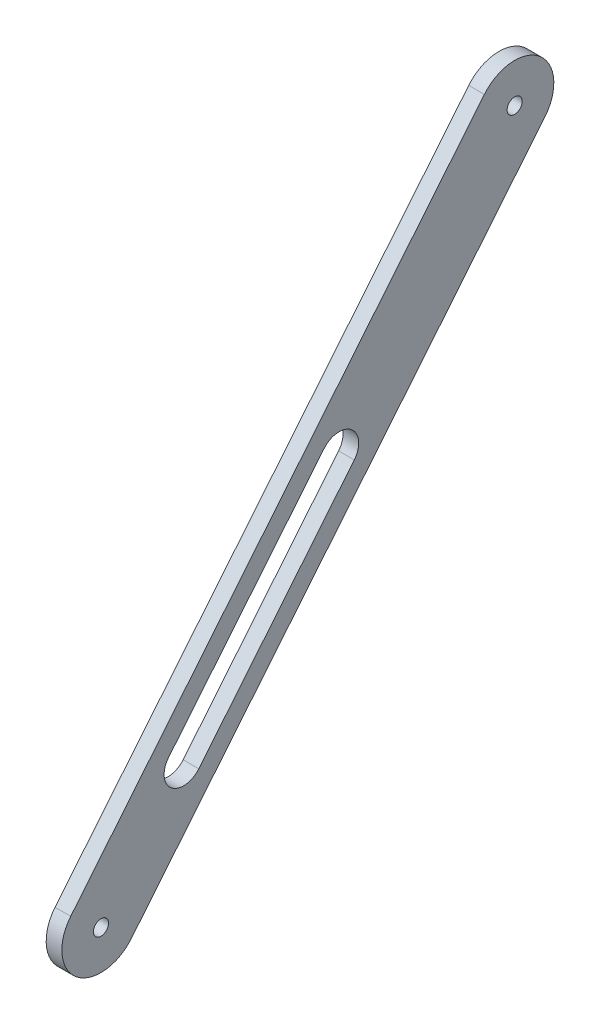
ISO-10303-21;
HEADER;
FILE_DESCRIPTION(('STEP AP214'),'2;1');
FILE_NAME('part.step','',(''),(''),'','','');
FILE_SCHEMA(('AUTOMOTIVE_DESIGN { 1 0 10303 214 1 1 1 1 }'));
ENDSEC;
DATA;
#1=APPLICATION_CONTEXT('core data for automotive mechanical design processes');
#2=APPLICATION_PROTOCOL_DEFINITION('international standard','automotive_design',2000,#1);
#3=PRODUCT_CONTEXT('',#1,'mechanical');
#4=PRODUCT('Part','Part','',(#3));
#5=PRODUCT_RELATED_PRODUCT_CATEGORY('part','',(#4));
#6=PRODUCT_DEFINITION_FORMATION('','',#4);
#7=PRODUCT_DEFINITION_CONTEXT('part definition',#1,'design');
#8=PRODUCT_DEFINITION('design','',#6,#7);
#9=PRODUCT_DEFINITION_SHAPE('','',#8);
#10=(LENGTH_UNIT() NAMED_UNIT(*) SI_UNIT(.MILLI.,.METRE.));
#11=(NAMED_UNIT(*) PLANE_ANGLE_UNIT() SI_UNIT($,.RADIAN.));
#12=(NAMED_UNIT(*) SI_UNIT($,.STERADIAN.) SOLID_ANGLE_UNIT());
#13=UNCERTAINTY_MEASURE_WITH_UNIT(LENGTH_MEASURE(1.E-05),#10,'distance_accuracy_value','');
#14=(GEOMETRIC_REPRESENTATION_CONTEXT(3) GLOBAL_UNCERTAINTY_ASSIGNED_CONTEXT((#13)) GLOBAL_UNIT_ASSIGNED_CONTEXT((#10,
#11,#12)) REPRESENTATION_CONTEXT('',''));
#15=CARTESIAN_POINT('',(0.,0.,0.));
#16=DIRECTION('',(0.,0.,1.));
#17=DIRECTION('',(1.,0.,0.));
#18=AXIS2_PLACEMENT_3D('',#15,#16,#17);
#19=CARTESIAN_POINT('',(-4.00000000017756,21949.5715431067,-17815.443941645));
#20=DIRECTION('',(0.,-0.633762743813113,-0.773527494375264));
#21=DIRECTION('',(0.,0.773527494375265,-0.633762743813113));
#22=AXIS2_PLACEMENT_3D('',#19,#20,#21);
#23=PLANE('',#22);
#24=DIRECTION('',(0.,-0.773527494375265,0.633762743813113));
#25=VECTOR('',#24,1.);
#26=CARTESIAN_POINT('',(-7.00000000017756,21949.5715431067,-17815.443941645));
#27=LINE('',#26,#25);
#28=CARTESIAN_POINT('',(-6.9999999999992,107.394735413521,80.1809781579693));
#29=VERTEX_POINT('',#28);
#30=CARTESIAN_POINT('',(-6.99999999999841,10.6467794213656,159.448037821336));
#31=VERTEX_POINT('',#30);
#32=EDGE_CURVE('E136',#29,#31,#27,.T.);
#33=ORIENTED_EDGE('',*,*,#32,.F.);
#34=DIRECTION('',(-1.,0.,0.));
#35=VECTOR('',#34,1.);
#36=CARTESIAN_POINT('',(-3.9999999999992,107.394735413521,80.1809781579693));
#37=LINE('',#36,#35);
#38=CARTESIAN_POINT('',(-3.9999999999992,107.394735413521,80.1809781579693));
#39=VERTEX_POINT('',#38);
#40=EDGE_CURVE('E11',#39,#29,#37,.T.);
#41=ORIENTED_EDGE('',*,*,#40,.F.);
#42=DIRECTION('',(0.,-0.773527494375265,0.633762743813113));
#43=VECTOR('',#42,1.);
#44=CARTESIAN_POINT('',(-4.00000000017756,21949.5715431067,-17815.443941645));
#45=LINE('',#44,#43);
#46=CARTESIAN_POINT('',(-3.99999999999841,10.6467794213656,159.448037821336));
#47=VERTEX_POINT('',#46);
#48=EDGE_CURVE('E140',#39,#47,#45,.T.);
#49=ORIENTED_EDGE('',*,*,#48,.T.);
#50=DIRECTION('',(-1.,0.,0.));
#51=VECTOR('',#50,1.);
#52=CARTESIAN_POINT('',(-3.99999999999841,10.6467794213656,159.448037821336));
#53=LINE('',#52,#51);
#54=EDGE_CURVE('E38',#47,#31,#53,.T.);
#55=ORIENTED_EDGE('',*,*,#54,.T.);
#56=EDGE_LOOP('',(#33,#41,#49,#55));
#57=FACE_BOUND('',#56,.T.);
#58=ADVANCED_FACE('F35',(#57),#23,.T.);
#59=CARTESIAN_POINT('',(-3.99999999999914,112.147955992155,85.9824343657549));
#60=DIRECTION('',(-1.,0.,0.));
#61=DIRECTION('',(0.,0.,1.));
#62=AXIS2_PLACEMENT_3D('',#59,#60,#61);
#63=CYLINDRICAL_SURFACE('',#62,7.49999999999999);
#64=CARTESIAN_POINT('',(-6.99999999999914,112.147955992155,85.9824343657549));
#65=DIRECTION('',(-1.,0.,0.));
#66=DIRECTION('',(0.,0.,1.));
#67=AXIS2_PLACEMENT_3D('',#64,#65,#66);
#68=CIRCLE('',#67,7.49999999999999);
#69=CARTESIAN_POINT('',(-6.99999999999909,116.901176570709,91.7838905736058));
#70=VERTEX_POINT('',#69);
#71=EDGE_CURVE('E144',#70,#29,#68,.T.);
#72=ORIENTED_EDGE('',*,*,#71,.F.);
#73=DIRECTION('',(-1.,0.,0.));
#74=VECTOR('',#73,1.);
#75=CARTESIAN_POINT('',(-3.99999999999909,116.901176570709,91.7838905736058));
#76=LINE('',#75,#74);
#77=CARTESIAN_POINT('',(-3.99999999999909,116.901176570709,91.7838905736058));
#78=VERTEX_POINT('',#77);
#79=EDGE_CURVE('E43',#78,#70,#76,.T.);
#80=ORIENTED_EDGE('',*,*,#79,.F.);
#81=CARTESIAN_POINT('',(-3.99999999999914,112.147955992155,85.9824343657549));
#82=DIRECTION('',(-1.,0.,0.));
#83=DIRECTION('',(0.,0.,1.));
#84=AXIS2_PLACEMENT_3D('',#81,#82,#83);
#85=CIRCLE('',#84,7.49999999999999);
#86=EDGE_CURVE('E150',#78,#39,#85,.T.);
#87=ORIENTED_EDGE('',*,*,#86,.T.);
#88=ORIENTED_EDGE('',*,*,#40,.T.);
#89=EDGE_LOOP('',(#72,#80,#87,#88));
#90=FACE_BOUND('',#89,.T.);
#91=ADVANCED_FACE('F176',(#90),#63,.T.);
#92=CARTESIAN_POINT('',(-4.00000000017745,21959.077984264,-17803.8410292294));
#93=DIRECTION('',(0.,0.633762743813113,0.773527494375264));
#94=DIRECTION('',(0.,-0.773527494375264,0.633762743813113));
#95=AXIS2_PLACEMENT_3D('',#92,#93,#94);
#96=PLANE('',#95);
#97=DIRECTION('',(0.,0.773527494375264,-0.633762743813113));
#98=VECTOR('',#97,1.);
#99=CARTESIAN_POINT('',(-7.00000000017745,21959.077984264,-17803.8410292294));
#100=LINE('',#99,#98);
#101=CARTESIAN_POINT('',(-6.99999999999829,20.1532205786314,171.050950236992));
#102=VERTEX_POINT('',#101);
#103=EDGE_CURVE('E158',#102,#70,#100,.T.);
#104=ORIENTED_EDGE('',*,*,#103,.F.);
#105=DIRECTION('',(-1.,0.,0.));
#106=VECTOR('',#105,1.);
#107=CARTESIAN_POINT('',(-3.99999999999829,20.1532205786314,171.050950236992));
#108=LINE('',#107,#106);
#109=CARTESIAN_POINT('',(-3.99999999999829,20.1532205786314,171.050950236992));
#110=VERTEX_POINT('',#109);
#111=EDGE_CURVE('E163',#110,#102,#108,.T.);
#112=ORIENTED_EDGE('',*,*,#111,.F.);
#113=DIRECTION('',(0.,0.773527494375264,-0.633762743813113));
#114=VECTOR('',#113,1.);
#115=CARTESIAN_POINT('',(-4.00000000017745,21959.077984264,-17803.8410292294));
#116=LINE('',#115,#114);
#117=EDGE_CURVE('E147',#110,#78,#116,.T.);
#118=ORIENTED_EDGE('',*,*,#117,.T.);
#119=ORIENTED_EDGE('',*,*,#79,.T.);
#120=EDGE_LOOP('',(#104,#112,#118,#119));
#121=FACE_BOUND('',#120,.T.);
#122=ADVANCED_FACE('F180',(#121),#96,.T.);
#123=CARTESIAN_POINT('',(-3.99999999999835,15.4,165.249494029121));
#124=DIRECTION('',(-1.,0.,0.));
#125=DIRECTION('',(0.,0.,1.));
#126=AXIS2_PLACEMENT_3D('',#123,#124,#125);
#127=CYLINDRICAL_SURFACE('',#126,7.50000000000002);
#128=CARTESIAN_POINT('',(-6.99999999999835,15.4,165.249494029121));
#129=DIRECTION('',(-1.,0.,0.));
#130=DIRECTION('',(0.,0.,1.));
#131=AXIS2_PLACEMENT_3D('',#128,#129,#130);
#132=CIRCLE('',#131,7.50000000000002);
#133=EDGE_CURVE('E155',#31,#102,#132,.T.);
#134=ORIENTED_EDGE('',*,*,#133,.F.);
#135=ORIENTED_EDGE('',*,*,#54,.F.);
#136=CARTESIAN_POINT('',(-3.99999999999835,15.4,165.249494029121));
#137=DIRECTION('',(-1.,0.,0.));
#138=DIRECTION('',(0.,0.,1.));
#139=AXIS2_PLACEMENT_3D('',#136,#137,#138);
#140=CIRCLE('',#139,7.50000000000002);
#141=EDGE_CURVE('E143',#47,#110,#140,.T.);
#142=ORIENTED_EDGE('',*,*,#141,.T.);
#143=ORIENTED_EDGE('',*,*,#111,.T.);
#144=EDGE_LOOP('',(#134,#135,#142,#143));
#145=FACE_BOUND('',#144,.T.);
#146=ADVANCED_FACE('F171',(#145),#127,.T.);
#147=CARTESIAN_POINT('',(-3.99999999999835,15.4,165.249494029121));
#148=DIRECTION('',(-1.,0.,0.));
#149=DIRECTION('',(0.,0.,1.));
#150=AXIS2_PLACEMENT_3D('',#147,#148,#149);
#151=PLANE('',#150);
#152=CARTESIAN_POINT('',(-3.99999999999914,112.147955992155,85.982434365755));
#153=DIRECTION('',(-1.,0.,0.));
#154=DIRECTION('',(0.,0.,1.));
#155=AXIS2_PLACEMENT_3D('',#152,#153,#154);
#156=CIRCLE('',#155,1.44999999999999);
#157=CARTESIAN_POINT('',(-3.99999999999913,112.147955992155,87.432434365755));
#158=VERTEX_POINT('',#157);
#159=EDGE_CURVE('E288',#158,#158,#156,.T.);
#160=ORIENTED_EDGE('',*,*,#159,.T.);
#161=EDGE_LOOP('',(#160));
#162=FACE_BOUND('',#161,.T.);
#163=CARTESIAN_POINT('',(-3.99999999999835,15.4,165.249494029121));
#164=DIRECTION('',(-1.,0.,0.));
#165=DIRECTION('',(0.,0.,1.));
#166=AXIS2_PLACEMENT_3D('',#163,#164,#165);
#167=CIRCLE('',#166,1.45);
#168=CARTESIAN_POINT('',(-3.99999999999834,15.4,166.699494029121));
#169=VERTEX_POINT('',#168);
#170=EDGE_CURVE('E124',#169,#169,#167,.T.);
#171=ORIENTED_EDGE('',*,*,#170,.T.);
#172=EDGE_LOOP('',(#171));
#173=FACE_BOUND('',#172,.T.);
#174=CARTESIAN_POINT('',(-3.99999999999881,71.093979595019,119.618576474577));
#175=DIRECTION('',(-1.,0.,0.));
#176=DIRECTION('',(0.,0.,1.));
#177=AXIS2_PLACEMENT_3D('',#174,#175,#176);
#178=CIRCLE('',#177,3.75000000000029);
#179=CARTESIAN_POINT('',(-3.99999999999878,73.4705898842804,122.519304578516));
#180=VERTEX_POINT('',#179);
#181=CARTESIAN_POINT('',(-3.99999999999884,68.7173693057074,116.71784837068));
#182=VERTEX_POINT('',#181);
#183=EDGE_CURVE('E108',#180,#182,#178,.T.);
#184=ORIENTED_EDGE('',*,*,#183,.T.);
#185=DIRECTION('',(0.,-0.773527494375264,0.633762743813113));
#186=VECTOR('',#185,1.);
#187=CARTESIAN_POINT('',(-4.00000000017753,21951.9481533962,-17812.5432135413));
#188=LINE('',#187,#186);
#189=CARTESIAN_POINT('',(-3.99999999999854,32.3615770700676,146.504697329898));
#190=VERTEX_POINT('',#189);
#191=EDGE_CURVE('E102',#182,#190,#188,.T.);
#192=ORIENTED_EDGE('',*,*,#191,.T.);
#193=CARTESIAN_POINT('',(-3.99999999999851,34.7381873593816,149.405425433794));
#194=DIRECTION('',(-1.,0.,0.));
#195=DIRECTION('',(0.,0.,1.));
#196=AXIS2_PLACEMENT_3D('',#193,#194,#195);
#197=CIRCLE('',#196,3.75000000000032);
#198=CARTESIAN_POINT('',(-3.99999999999848,37.1147976486775,152.306153537704));
#199=VERTEX_POINT('',#198);
#200=EDGE_CURVE('E111',#190,#199,#197,.T.);
#201=ORIENTED_EDGE('',*,*,#200,.T.);
#202=DIRECTION('',(0.,0.773527494375264,-0.633762743813114));
#203=VECTOR('',#202,1.);
#204=CARTESIAN_POINT('',(-4.00000000017748,21956.7013739752,-17806.7417573338));
#205=LINE('',#204,#203);
#206=EDGE_CURVE('E51',#199,#180,#205,.T.);
#207=ORIENTED_EDGE('',*,*,#206,.T.);
#208=EDGE_LOOP('',(#184,#192,#201,#207));
#209=FACE_BOUND('',#208,.T.);
#210=ORIENTED_EDGE('',*,*,#48,.F.);
#211=ORIENTED_EDGE('',*,*,#86,.F.);
#212=ORIENTED_EDGE('',*,*,#117,.F.);
#213=ORIENTED_EDGE('',*,*,#141,.F.);
#214=EDGE_LOOP('',(#210,#211,#212,#213));
#215=FACE_BOUND('',#214,.T.);
#216=ADVANCED_FACE('F115',(#162,#173,#209,#215),#151,.F.);
#217=CARTESIAN_POINT('',(-6.99999999999835,15.4,165.249494029121));
#218=DIRECTION('',(-1.,0.,0.));
#219=DIRECTION('',(0.,0.,1.));
#220=AXIS2_PLACEMENT_3D('',#217,#218,#219);
#221=PLANE('',#220);
#222=CARTESIAN_POINT('',(-7.00000000000007,112.147955992155,85.982434365755));
#223=DIRECTION('',(1.,0.,0.));
#224=DIRECTION('',(0.,0.,-1.));
#225=AXIS2_PLACEMENT_3D('',#222,#223,#224);
#226=CIRCLE('',#225,1.44999999999999);
#227=CARTESIAN_POINT('',(-7.00000000000008,112.147955992155,84.532434365755));
#228=VERTEX_POINT('',#227);
#229=EDGE_CURVE('E285',#228,#228,#226,.T.);
#230=ORIENTED_EDGE('',*,*,#229,.T.);
#231=EDGE_LOOP('',(#230));
#232=FACE_BOUND('',#231,.T.);
#233=CARTESIAN_POINT('',(-6.99999999999928,15.4,165.249494029122));
#234=DIRECTION('',(1.,0.,0.));
#235=DIRECTION('',(0.,0.,-1.));
#236=AXIS2_PLACEMENT_3D('',#233,#234,#235);
#237=CIRCLE('',#236,1.45);
#238=CARTESIAN_POINT('',(-6.99999999999929,15.4,163.799494029122));
#239=VERTEX_POINT('',#238);
#240=EDGE_CURVE('E289',#239,#239,#237,.T.);
#241=ORIENTED_EDGE('',*,*,#240,.T.);
#242=EDGE_LOOP('',(#241));
#243=FACE_BOUND('',#242,.T.);
#244=DIRECTION('',(0.,-0.773527494375264,0.633762743813113));
#245=VECTOR('',#244,1.);
#246=CARTESIAN_POINT('',(-7.00000000017753,21951.9481533962,-17812.5432135413));
#247=LINE('',#246,#245);
#248=CARTESIAN_POINT('',(-6.99999999999884,68.7173693057074,116.71784837068));
#249=VERTEX_POINT('',#248);
#250=CARTESIAN_POINT('',(-6.99999999999854,32.3615770700676,146.504697329898));
#251=VERTEX_POINT('',#250);
#252=EDGE_CURVE('E59',#249,#251,#247,.T.);
#253=ORIENTED_EDGE('',*,*,#252,.F.);
#254=CARTESIAN_POINT('',(-6.99999999999881,71.093979595019,119.618576474577));
#255=DIRECTION('',(-1.,0.,0.));
#256=DIRECTION('',(0.,0.,1.));
#257=AXIS2_PLACEMENT_3D('',#254,#255,#256);
#258=CIRCLE('',#257,3.75000000000029);
#259=CARTESIAN_POINT('',(-6.99999999999878,73.4705898842804,122.519304578516));
#260=VERTEX_POINT('',#259);
#261=EDGE_CURVE('E118',#260,#249,#258,.T.);
#262=ORIENTED_EDGE('',*,*,#261,.F.);
#263=DIRECTION('',(0.,0.773527494375264,-0.633762743813114));
#264=VECTOR('',#263,1.);
#265=CARTESIAN_POINT('',(-7.00000000017748,21956.7013739752,-17806.7417573338));
#266=LINE('',#265,#264);
#267=CARTESIAN_POINT('',(-6.99999999999848,37.1147976487158,152.306153537751));
#268=VERTEX_POINT('',#267);
#269=EDGE_CURVE('E121',#268,#260,#266,.T.);
#270=ORIENTED_EDGE('',*,*,#269,.F.);
#271=CARTESIAN_POINT('',(-6.99999999999851,34.7381873593816,149.405425433794));
#272=DIRECTION('',(-1.,0.,0.));
#273=DIRECTION('',(0.,0.,1.));
#274=AXIS2_PLACEMENT_3D('',#271,#272,#273);
#275=CIRCLE('',#274,3.75000000000032);
#276=EDGE_CURVE('E130',#251,#268,#275,.T.);
#277=ORIENTED_EDGE('',*,*,#276,.F.);
#278=EDGE_LOOP('',(#253,#262,#270,#277));
#279=FACE_BOUND('',#278,.T.);
#280=ORIENTED_EDGE('',*,*,#32,.T.);
#281=ORIENTED_EDGE('',*,*,#133,.T.);
#282=ORIENTED_EDGE('',*,*,#103,.T.);
#283=ORIENTED_EDGE('',*,*,#71,.T.);
#284=EDGE_LOOP('',(#280,#281,#282,#283));
#285=FACE_BOUND('',#284,.T.);
#286=ADVANCED_FACE('F173',(#232,#243,#279,#285),#221,.T.);
#287=CARTESIAN_POINT('',(-4.00000000017753,21951.9481533962,-17812.5432135413));
#288=DIRECTION('',(0.,-0.633762743813113,-0.773527494375264));
#289=DIRECTION('',(0.,0.773527494375264,-0.633762743813113));
#290=AXIS2_PLACEMENT_3D('',#287,#288,#289);
#291=PLANE('',#290);
#292=ORIENTED_EDGE('',*,*,#252,.T.);
#293=DIRECTION('',(-1.,0.,0.));
#294=VECTOR('',#293,1.);
#295=CARTESIAN_POINT('',(-3.99999999999854,32.3615770700676,146.504697329898));
#296=LINE('',#295,#294);
#297=EDGE_CURVE('E98',#190,#251,#296,.T.);
#298=ORIENTED_EDGE('',*,*,#297,.F.);
#299=ORIENTED_EDGE('',*,*,#191,.F.);
#300=DIRECTION('',(-1.,0.,0.));
#301=VECTOR('',#300,1.);
#302=CARTESIAN_POINT('',(-3.99999999999884,68.7173693057074,116.71784837068));
#303=LINE('',#302,#301);
#304=EDGE_CURVE('E134',#182,#249,#303,.T.);
#305=ORIENTED_EDGE('',*,*,#304,.T.);
#306=EDGE_LOOP('',(#292,#298,#299,#305));
#307=FACE_BOUND('',#306,.T.);
#308=ADVANCED_FACE('F100',(#307),#291,.F.);
#309=CARTESIAN_POINT('',(-3.99999999999881,71.093979595019,119.618576474577));
#310=DIRECTION('',(-1.,0.,0.));
#311=DIRECTION('',(0.,0.,1.));
#312=AXIS2_PLACEMENT_3D('',#309,#310,#311);
#313=CYLINDRICAL_SURFACE('',#312,3.75000000000029);
#314=ORIENTED_EDGE('',*,*,#261,.T.);
#315=ORIENTED_EDGE('',*,*,#304,.F.);
#316=ORIENTED_EDGE('',*,*,#183,.F.);
#317=DIRECTION('',(-1.,0.,0.));
#318=VECTOR('',#317,1.);
#319=CARTESIAN_POINT('',(-3.99999999999878,73.4705898842804,122.519304578516));
#320=LINE('',#319,#318);
#321=EDGE_CURVE('E137',#180,#260,#320,.T.);
#322=ORIENTED_EDGE('',*,*,#321,.T.);
#323=EDGE_LOOP('',(#314,#315,#316,#322));
#324=FACE_BOUND('',#323,.T.);
#325=ADVANCED_FACE('F216',(#324),#313,.F.);
#326=CARTESIAN_POINT('',(-4.00000000017748,21956.7013739752,-17806.7417573338));
#327=DIRECTION('',(0.,0.633762743813114,0.773527494375263));
#328=DIRECTION('',(0.,-0.773527494375264,0.633762743813114));
#329=AXIS2_PLACEMENT_3D('',#326,#327,#328);
#330=PLANE('',#329);
#331=ORIENTED_EDGE('',*,*,#269,.T.);
#332=ORIENTED_EDGE('',*,*,#321,.F.);
#333=ORIENTED_EDGE('',*,*,#206,.F.);
#334=DIRECTION('',(-1.,0.,0.));
#335=VECTOR('',#334,1.);
#336=CARTESIAN_POINT('',(-3.99999999999848,37.1147976487158,152.306153537751));
#337=LINE('',#336,#335);
#338=EDGE_CURVE('E107',#199,#268,#337,.T.);
#339=ORIENTED_EDGE('',*,*,#338,.T.);
#340=EDGE_LOOP('',(#331,#332,#333,#339));
#341=FACE_BOUND('',#340,.T.);
#342=ADVANCED_FACE('F227',(#341),#330,.F.);
#343=CARTESIAN_POINT('',(-3.99999999999851,34.7381873593816,149.405425433794));
#344=DIRECTION('',(-1.,0.,0.));
#345=DIRECTION('',(0.,0.,1.));
#346=AXIS2_PLACEMENT_3D('',#343,#344,#345);
#347=CYLINDRICAL_SURFACE('',#346,3.75000000000032);
#348=ORIENTED_EDGE('',*,*,#276,.T.);
#349=ORIENTED_EDGE('',*,*,#338,.F.);
#350=ORIENTED_EDGE('',*,*,#200,.F.);
#351=ORIENTED_EDGE('',*,*,#297,.T.);
#352=EDGE_LOOP('',(#348,#349,#350,#351));
#353=FACE_BOUND('',#352,.T.);
#354=ADVANCED_FACE('F112',(#353),#347,.F.);
#355=CARTESIAN_POINT('',(1.64697918276248E-12,15.4,165.249494029121));
#356=DIRECTION('',(1.,0.,0.));
#357=DIRECTION('',(0.,0.,-1.));
#358=AXIS2_PLACEMENT_3D('',#355,#356,#357);
#359=CYLINDRICAL_SURFACE('',#358,1.45);
#360=ORIENTED_EDGE('',*,*,#240,.F.);
#361=EDGE_LOOP('',(#360));
#362=FACE_BOUND('',#361,.T.);
#363=ORIENTED_EDGE('',*,*,#170,.F.);
#364=EDGE_LOOP('',(#363));
#365=FACE_BOUND('',#364,.T.);
#366=ADVANCED_FACE('F245',(#362,#365),#359,.F.);
#367=CARTESIAN_POINT('',(8.56954390787326E-13,112.147955992155,85.9824343657549));
#368=DIRECTION('',(1.,0.,0.));
#369=DIRECTION('',(0.,0.,-1.));
#370=AXIS2_PLACEMENT_3D('',#367,#368,#369);
#371=CYLINDRICAL_SURFACE('',#370,1.44999999999999);
#372=ORIENTED_EDGE('',*,*,#229,.F.);
#373=EDGE_LOOP('',(#372));
#374=FACE_BOUND('',#373,.T.);
#375=ORIENTED_EDGE('',*,*,#159,.F.);
#376=EDGE_LOOP('',(#375));
#377=FACE_BOUND('',#376,.T.);
#378=ADVANCED_FACE('F268',(#374,#377),#371,.F.);
#379=CLOSED_SHELL('',(#58,#91,#122,#146,#216,#286,#308,#325,#342,#354,#366,#378));
#380=MANIFOLD_SOLID_BREP('B2',#379);
#381=ADVANCED_BREP_SHAPE_REPRESENTATION('',(#18,#380),#14);
#382=SHAPE_DEFINITION_REPRESENTATION(#9,#381);
ENDSEC;
END-ISO-10303-21;
